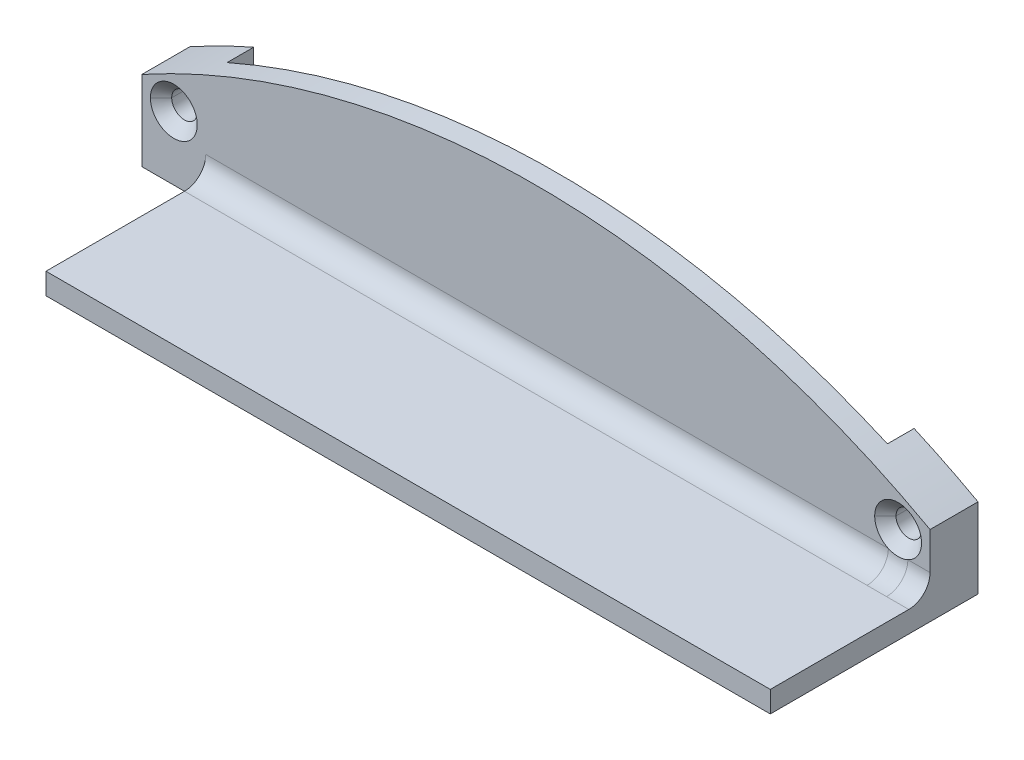
ISO-10303-21;
HEADER;
FILE_DESCRIPTION(('STEP AP214'),'2;1');
FILE_NAME('part.step','',(''),(''),'','','');
FILE_SCHEMA(('AUTOMOTIVE_DESIGN { 1 0 10303 214 1 1 1 1 }'));
ENDSEC;
DATA;
#1=APPLICATION_CONTEXT('core data for automotive mechanical design processes');
#2=APPLICATION_PROTOCOL_DEFINITION('international standard','automotive_design',2000,#1);
#3=PRODUCT_CONTEXT('',#1,'mechanical');
#4=PRODUCT('Part','Part','',(#3));
#5=PRODUCT_RELATED_PRODUCT_CATEGORY('part','',(#4));
#6=PRODUCT_DEFINITION_FORMATION('','',#4);
#7=PRODUCT_DEFINITION_CONTEXT('part definition',#1,'design');
#8=PRODUCT_DEFINITION('design','',#6,#7);
#9=PRODUCT_DEFINITION_SHAPE('','',#8);
#10=(LENGTH_UNIT() NAMED_UNIT(*) SI_UNIT(.MILLI.,.METRE.));
#11=(NAMED_UNIT(*) PLANE_ANGLE_UNIT() SI_UNIT($,.RADIAN.));
#12=(NAMED_UNIT(*) SI_UNIT($,.STERADIAN.) SOLID_ANGLE_UNIT());
#13=UNCERTAINTY_MEASURE_WITH_UNIT(LENGTH_MEASURE(1.E-05),#10,'distance_accuracy_value','');
#14=(GEOMETRIC_REPRESENTATION_CONTEXT(3) GLOBAL_UNCERTAINTY_ASSIGNED_CONTEXT((#13)) GLOBAL_UNIT_ASSIGNED_CONTEXT((#10,
#11,#12)) REPRESENTATION_CONTEXT('',''));
#15=CARTESIAN_POINT('',(0.,0.,0.));
#16=DIRECTION('',(0.,0.,1.));
#17=DIRECTION('',(1.,0.,0.));
#18=AXIS2_PLACEMENT_3D('',#15,#16,#17);
#19=CARTESIAN_POINT('',(3.,6.,2.));
#20=DIRECTION('',(0.,0.,1.));
#21=DIRECTION('',(1.,0.,0.));
#22=AXIS2_PLACEMENT_3D('',#19,#20,#21);
#23=CONICAL_SURFACE('',#22,2.2,0.785398163397448);
#24=CARTESIAN_POINT('',(3.,6.,1.));
#25=DIRECTION('',(0.,0.,1.));
#26=DIRECTION('',(1.,0.,0.));
#27=AXIS2_PLACEMENT_3D('',#24,#25,#26);
#28=CIRCLE('',#27,1.2);
#29=CARTESIAN_POINT('',(1.8,6.,1.));
#30=VERTEX_POINT('',#29);
#31=CARTESIAN_POINT('',(4.2,6.,1.));
#32=VERTEX_POINT('',#31);
#33=EDGE_CURVE('E41',#30,#32,#28,.T.);
#34=ORIENTED_EDGE('',*,*,#33,.F.);
#35=DIRECTION('',(-0.707106781186547,0.,0.707106781186548));
#36=VECTOR('',#35,1.);
#37=CARTESIAN_POINT('',(0.8,6.,2.));
#38=LINE('',#37,#36);
#39=CARTESIAN_POINT('',(0.8,6.,2.));
#40=VERTEX_POINT('',#39);
#41=EDGE_CURVE('E11',#30,#40,#38,.T.);
#42=ORIENTED_EDGE('',*,*,#41,.T.);
#43=CARTESIAN_POINT('',(3.,6.,2.));
#44=DIRECTION('',(0.,0.,1.));
#45=DIRECTION('',(1.,0.,0.));
#46=AXIS2_PLACEMENT_3D('',#43,#44,#45);
#47=CIRCLE('',#46,2.2);
#48=CARTESIAN_POINT('',(5.2,6.,2.));
#49=VERTEX_POINT('',#48);
#50=EDGE_CURVE('E27',#40,#49,#47,.T.);
#51=ORIENTED_EDGE('',*,*,#50,.T.);
#52=DIRECTION('',(0.707106781186547,0.,0.707106781186548));
#53=VECTOR('',#52,1.);
#54=CARTESIAN_POINT('',(5.2,6.,2.));
#55=LINE('',#54,#53);
#56=EDGE_CURVE('E255',#32,#49,#55,.T.);
#57=ORIENTED_EDGE('',*,*,#56,.F.);
#58=EDGE_LOOP('',(#34,#42,#51,#57));
#59=FACE_BOUND('',#58,.T.);
#60=ADVANCED_FACE('F16',(#59),#23,.F.);
#61=CARTESIAN_POINT('',(3.,6.,2.));
#62=DIRECTION('',(0.,0.,1.));
#63=DIRECTION('',(1.,0.,0.));
#64=AXIS2_PLACEMENT_3D('',#61,#62,#63);
#65=CYLINDRICAL_SURFACE('',#64,1.2);
#66=CARTESIAN_POINT('',(3.,6.,-2.5));
#67=DIRECTION('',(0.,0.,-1.));
#68=DIRECTION('',(-1.,0.,0.));
#69=AXIS2_PLACEMENT_3D('',#66,#67,#68);
#70=CIRCLE('',#69,1.2);
#71=CARTESIAN_POINT('',(4.2,6.,-2.5));
#72=VERTEX_POINT('',#71);
#73=CARTESIAN_POINT('',(1.8,6.,-2.5));
#74=VERTEX_POINT('',#73);
#75=EDGE_CURVE('E294',#72,#74,#70,.T.);
#76=ORIENTED_EDGE('',*,*,#75,.T.);
#77=DIRECTION('',(0.,0.,1.));
#78=VECTOR('',#77,1.);
#79=CARTESIAN_POINT('',(1.8,6.,2.));
#80=LINE('',#79,#78);
#81=EDGE_CURVE('E298',#74,#30,#80,.T.);
#82=ORIENTED_EDGE('',*,*,#81,.T.);
#83=ORIENTED_EDGE('',*,*,#33,.T.);
#84=DIRECTION('',(0.,0.,1.));
#85=VECTOR('',#84,1.);
#86=CARTESIAN_POINT('',(4.2,6.,2.));
#87=LINE('',#86,#85);
#88=EDGE_CURVE('E254',#72,#32,#87,.T.);
#89=ORIENTED_EDGE('',*,*,#88,.F.);
#90=EDGE_LOOP('',(#76,#82,#83,#89));
#91=FACE_BOUND('',#90,.T.);
#92=ADVANCED_FACE('F387',(#91),#65,.F.);
#93=CARTESIAN_POINT('',(71.,6.,2.));
#94=DIRECTION('',(0.,0.,1.));
#95=DIRECTION('',(1.,0.,0.));
#96=AXIS2_PLACEMENT_3D('',#93,#94,#95);
#97=CONICAL_SURFACE('',#96,2.2,0.785398163397455);
#98=CARTESIAN_POINT('',(71.,6.,1.));
#99=DIRECTION('',(0.,0.,1.));
#100=DIRECTION('',(1.,0.,0.));
#101=AXIS2_PLACEMENT_3D('',#98,#99,#100);
#102=CIRCLE('',#101,1.2);
#103=CARTESIAN_POINT('',(69.8,6.,1.));
#104=VERTEX_POINT('',#103);
#105=CARTESIAN_POINT('',(72.2,6.,1.));
#106=VERTEX_POINT('',#105);
#107=EDGE_CURVE('E318',#104,#106,#102,.T.);
#108=ORIENTED_EDGE('',*,*,#107,.F.);
#109=DIRECTION('',(-0.707106781186552,0.,0.707106781186543));
#110=VECTOR('',#109,1.);
#111=CARTESIAN_POINT('',(68.8,6.,2.));
#112=LINE('',#111,#110);
#113=CARTESIAN_POINT('',(68.8,6.,2.));
#114=VERTEX_POINT('',#113);
#115=EDGE_CURVE('E333',#104,#114,#112,.T.);
#116=ORIENTED_EDGE('',*,*,#115,.T.);
#117=CARTESIAN_POINT('',(71.,6.,2.));
#118=DIRECTION('',(0.,0.,1.));
#119=DIRECTION('',(1.,0.,0.));
#120=AXIS2_PLACEMENT_3D('',#117,#118,#119);
#121=CIRCLE('',#120,2.2);
#122=CARTESIAN_POINT('',(70.0834848610088,4.,2.));
#123=VERTEX_POINT('',#122);
#124=EDGE_CURVE('E469',#114,#123,#121,.T.);
#125=ORIENTED_EDGE('',*,*,#124,.T.);
#126=CARTESIAN_POINT('',(71.9165151389912,4.,2.));
#127=CARTESIAN_POINT('',(71.7904590776195,3.94223383184173,2.));
#128=CARTESIAN_POINT('',(71.6469467377403,3.89122086907555,2.00000000060984));
#129=CARTESIAN_POINT('',(71.3357030742167,3.81990989217853,1.99999999939016));
#130=CARTESIAN_POINT('',(71.1679841261311,3.79999561501596,2.00000000000037));
#131=CARTESIAN_POINT('',(70.8319010379191,3.80000438648259,1.99999999999963));
#132=CARTESIAN_POINT('',(70.6641748830029,3.81992811652026,1.99999999939023));
#133=CARTESIAN_POINT('',(70.3529202344418,3.89126109354636,2.00000000060977));
#134=CARTESIAN_POINT('',(70.2093938289862,3.94230123813048,2.));
#135=CARTESIAN_POINT('',(70.0834848610088,4.,2.));
#136=(BOUNDED_CURVE() B_SPLINE_CURVE(3,(#126,#127,#128,#129,#130,#131,#132,#133,#134,#135),
.UNSPECIFIED.,.F.,.F.) B_SPLINE_CURVE_WITH_KNOTS((4,2,2,2,4),(0.00382882052453302,
0.00428506631490956,0.0047413121052861,0.00519755789566263,0.00565380368603917),
.UNSPECIFIED.) CURVE() GEOMETRIC_REPRESENTATION_ITEM() RATIONAL_B_SPLINE_CURVE((1.,1.,1.,1.,1.,
1.,1.,1.,1.,1.)) REPRESENTATION_ITEM(''));
#137=CARTESIAN_POINT('',(71.9165151389912,4.,2.));
#138=VERTEX_POINT('',#137);
#139=EDGE_CURVE('E369',#123,#138,#136,.F.);
#140=ORIENTED_EDGE('',*,*,#139,.T.);
#141=CARTESIAN_POINT('',(71.,6.,2.));
#142=DIRECTION('',(0.,0.,1.));
#143=DIRECTION('',(1.,0.,0.));
#144=AXIS2_PLACEMENT_3D('',#141,#142,#143);
#145=CIRCLE('',#144,2.2);
#146=CARTESIAN_POINT('',(73.2,6.,2.));
#147=VERTEX_POINT('',#146);
#148=EDGE_CURVE('E263',#138,#147,#145,.T.);
#149=ORIENTED_EDGE('',*,*,#148,.T.);
#150=DIRECTION('',(0.707106781186552,0.,0.707106781186543));
#151=VECTOR('',#150,1.);
#152=CARTESIAN_POINT('',(73.2,6.,2.));
#153=LINE('',#152,#151);
#154=EDGE_CURVE('E241',#106,#147,#153,.T.);
#155=ORIENTED_EDGE('',*,*,#154,.F.);
#156=EDGE_LOOP('',(#108,#116,#125,#140,#149,#155));
#157=FACE_BOUND('',#156,.T.);
#158=ADVANCED_FACE('F376',(#157),#97,.F.);
#159=CARTESIAN_POINT('',(71.,6.,2.));
#160=DIRECTION('',(0.,0.,1.));
#161=DIRECTION('',(1.,0.,0.));
#162=AXIS2_PLACEMENT_3D('',#159,#160,#161);
#163=CYLINDRICAL_SURFACE('',#162,1.2);
#164=CARTESIAN_POINT('',(71.,6.,-2.5));
#165=DIRECTION('',(0.,0.,-1.));
#166=DIRECTION('',(-1.,0.,0.));
#167=AXIS2_PLACEMENT_3D('',#164,#165,#166);
#168=CIRCLE('',#167,1.2);
#169=CARTESIAN_POINT('',(72.2,6.,-2.5));
#170=VERTEX_POINT('',#169);
#171=CARTESIAN_POINT('',(69.8,6.,-2.5));
#172=VERTEX_POINT('',#171);
#173=EDGE_CURVE('E259',#170,#172,#168,.T.);
#174=ORIENTED_EDGE('',*,*,#173,.T.);
#175=DIRECTION('',(0.,0.,1.));
#176=VECTOR('',#175,1.);
#177=CARTESIAN_POINT('',(69.8,6.,2.));
#178=LINE('',#177,#176);
#179=EDGE_CURVE('E264',#172,#104,#178,.T.);
#180=ORIENTED_EDGE('',*,*,#179,.T.);
#181=ORIENTED_EDGE('',*,*,#107,.T.);
#182=DIRECTION('',(0.,0.,1.));
#183=VECTOR('',#182,1.);
#184=CARTESIAN_POINT('',(72.2,6.,2.));
#185=LINE('',#184,#183);
#186=EDGE_CURVE('E287',#170,#106,#185,.T.);
#187=ORIENTED_EDGE('',*,*,#186,.F.);
#188=EDGE_LOOP('',(#174,#180,#181,#187));
#189=FACE_BOUND('',#188,.T.);
#190=ADVANCED_FACE('F386',(#189),#163,.F.);
#191=CARTESIAN_POINT('',(37.,-59.8026315789474,2.));
#192=DIRECTION('',(0.,0.,-1.));
#193=DIRECTION('',(0.,-1.,0.));
#194=AXIS2_PLACEMENT_3D('',#191,#192,#193);
#195=PLANE('',#194);
#196=DIRECTION('',(0.,-1.,0.));
#197=VECTOR('',#196,1.);
#198=CARTESIAN_POINT('',(6.,0.,2.));
#199=LINE('',#198,#197);
#200=CARTESIAN_POINT('',(6.,4.,2.));
#201=VERTEX_POINT('',#200);
#202=CARTESIAN_POINT('',(6.,0.,2.));
#203=VERTEX_POINT('',#202);
#204=EDGE_CURVE('E340',#201,#203,#199,.T.);
#205=ORIENTED_EDGE('',*,*,#204,.F.);
#206=DIRECTION('',(1.,0.,0.));
#207=VECTOR('',#206,1.);
#208=CARTESIAN_POINT('',(74.,4.,2.));
#209=LINE('',#208,#207);
#210=EDGE_CURVE('E321',#201,#123,#209,.T.);
#211=ORIENTED_EDGE('',*,*,#210,.T.);
#212=ORIENTED_EDGE('',*,*,#124,.F.);
#213=CARTESIAN_POINT('',(71.,6.,2.));
#214=DIRECTION('',(0.,0.,1.));
#215=DIRECTION('',(1.,0.,0.));
#216=AXIS2_PLACEMENT_3D('',#213,#214,#215);
#217=CIRCLE('',#216,2.2);
#218=EDGE_CURVE('E245',#147,#114,#217,.T.);
#219=ORIENTED_EDGE('',*,*,#218,.F.);
#220=ORIENTED_EDGE('',*,*,#148,.F.);
#221=DIRECTION('',(1.,0.,0.));
#222=VECTOR('',#221,1.);
#223=CARTESIAN_POINT('',(74.,4.,2.));
#224=LINE('',#223,#222);
#225=CARTESIAN_POINT('',(74.,4.,2.));
#226=VERTEX_POINT('',#225);
#227=EDGE_CURVE('E279',#138,#226,#224,.T.);
#228=ORIENTED_EDGE('',*,*,#227,.T.);
#229=DIRECTION('',(0.,1.,0.));
#230=VECTOR('',#229,1.);
#231=CARTESIAN_POINT('',(74.,0.,2.));
#232=LINE('',#231,#230);
#233=CARTESIAN_POINT('',(74.,7.5,2.));
#234=VERTEX_POINT('',#233);
#235=EDGE_CURVE('E275',#226,#234,#232,.T.);
#236=ORIENTED_EDGE('',*,*,#235,.T.);
#237=CARTESIAN_POINT('',(37.,-59.8026315789474,2.));
#238=DIRECTION('',(0.,0.,1.));
#239=DIRECTION('',(-1.,0.,0.));
#240=AXIS2_PLACEMENT_3D('',#237,#238,#239);
#241=CIRCLE('',#240,76.8026315789473);
#242=CARTESIAN_POINT('',(0.,7.5,2.));
#243=VERTEX_POINT('',#242);
#244=EDGE_CURVE('E239',#234,#243,#241,.T.);
#245=ORIENTED_EDGE('',*,*,#244,.T.);
#246=DIRECTION('',(0.,-1.,0.));
#247=VECTOR('',#246,1.);
#248=CARTESIAN_POINT('',(0.,0.,2.));
#249=LINE('',#248,#247);
#250=CARTESIAN_POINT('',(0.,0.,2.));
#251=VERTEX_POINT('',#250);
#252=EDGE_CURVE('E235',#243,#251,#249,.T.);
#253=ORIENTED_EDGE('',*,*,#252,.T.);
#254=DIRECTION('',(1.,0.,0.));
#255=VECTOR('',#254,1.);
#256=CARTESIAN_POINT('',(0.,0.,2.));
#257=LINE('',#256,#255);
#258=EDGE_CURVE('E240',#251,#203,#257,.T.);
#259=ORIENTED_EDGE('',*,*,#258,.T.);
#260=EDGE_LOOP('',(#205,#211,#212,#219,#220,#228,#236,#245,#253,#259));
#261=FACE_BOUND('',#260,.T.);
#262=CARTESIAN_POINT('',(3.,6.,2.));
#263=DIRECTION('',(0.,0.,1.));
#264=DIRECTION('',(1.,0.,0.));
#265=AXIS2_PLACEMENT_3D('',#262,#263,#264);
#266=CIRCLE('',#265,2.2);
#267=EDGE_CURVE('E548',#49,#40,#266,.T.);
#268=ORIENTED_EDGE('',*,*,#267,.F.);
#269=ORIENTED_EDGE('',*,*,#50,.F.);
#270=EDGE_LOOP('',(#268,#269));
#271=FACE_BOUND('',#270,.T.);
#272=ADVANCED_FACE('F397',(#261,#271),#195,.F.);
#273=CARTESIAN_POINT('',(37.,-59.8026315789474,0.));
#274=DIRECTION('',(0.,0.,-1.));
#275=DIRECTION('',(0.,-1.,0.));
#276=AXIS2_PLACEMENT_3D('',#273,#274,#275);
#277=PLANE('',#276);
#278=CARTESIAN_POINT('',(37.,-59.8026315789474,0.));
#279=DIRECTION('',(0.,0.,1.));
#280=DIRECTION('',(-1.,0.,0.));
#281=AXIS2_PLACEMENT_3D('',#278,#279,#280);
#282=CIRCLE('',#281,76.8026315789473);
#283=CARTESIAN_POINT('',(68.,10.4657412316673,0.));
#284=VERTEX_POINT('',#283);
#285=CARTESIAN_POINT('',(6.,10.4657412316673,0.));
#286=VERTEX_POINT('',#285);
#287=EDGE_CURVE('E202',#284,#286,#282,.T.);
#288=ORIENTED_EDGE('',*,*,#287,.F.);
#289=DIRECTION('',(0.,1.,0.));
#290=VECTOR('',#289,1.);
#291=CARTESIAN_POINT('',(68.,0.,0.));
#292=LINE('',#291,#290);
#293=CARTESIAN_POINT('',(68.,0.,0.));
#294=VERTEX_POINT('',#293);
#295=EDGE_CURVE('E347',#294,#284,#292,.T.);
#296=ORIENTED_EDGE('',*,*,#295,.F.);
#297=DIRECTION('',(1.,0.,0.));
#298=VECTOR('',#297,1.);
#299=CARTESIAN_POINT('',(0.,0.,0.));
#300=LINE('',#299,#298);
#301=CARTESIAN_POINT('',(6.,0.,0.));
#302=VERTEX_POINT('',#301);
#303=EDGE_CURVE('E359',#302,#294,#300,.T.);
#304=ORIENTED_EDGE('',*,*,#303,.F.);
#305=DIRECTION('',(0.,-1.,0.));
#306=VECTOR('',#305,1.);
#307=CARTESIAN_POINT('',(6.,0.,0.));
#308=LINE('',#307,#306);
#309=EDGE_CURVE('E206',#286,#302,#308,.T.);
#310=ORIENTED_EDGE('',*,*,#309,.F.);
#311=EDGE_LOOP('',(#288,#296,#304,#310));
#312=FACE_BOUND('',#311,.T.);
#313=ADVANCED_FACE('F400',(#312),#277,.T.);
#314=CARTESIAN_POINT('',(0.,0.,2.));
#315=DIRECTION('',(1.,0.,0.));
#316=DIRECTION('',(0.,1.,0.));
#317=AXIS2_PLACEMENT_3D('',#314,#315,#316);
#318=PLANE('',#317);
#319=DIRECTION('',(0.,0.,-1.));
#320=VECTOR('',#319,1.);
#321=CARTESIAN_POINT('',(0.,7.5,2.));
#322=LINE('',#321,#320);
#323=CARTESIAN_POINT('',(0.,7.5,-2.5));
#324=VERTEX_POINT('',#323);
#325=EDGE_CURVE('E268',#243,#324,#322,.T.);
#326=ORIENTED_EDGE('',*,*,#325,.T.);
#327=DIRECTION('',(0.,1.,0.));
#328=VECTOR('',#327,1.);
#329=CARTESIAN_POINT('',(0.,0.,-2.5));
#330=LINE('',#329,#328);
#331=CARTESIAN_POINT('',(0.,0.,-2.5));
#332=VERTEX_POINT('',#331);
#333=EDGE_CURVE('E216',#332,#324,#330,.T.);
#334=ORIENTED_EDGE('',*,*,#333,.F.);
#335=DIRECTION('',(0.,0.,-1.));
#336=VECTOR('',#335,1.);
#337=CARTESIAN_POINT('',(0.,0.,2.));
#338=LINE('',#337,#336);
#339=EDGE_CURVE('E280',#251,#332,#338,.T.);
#340=ORIENTED_EDGE('',*,*,#339,.F.);
#341=ORIENTED_EDGE('',*,*,#252,.F.);
#342=EDGE_LOOP('',(#326,#334,#340,#341));
#343=FACE_BOUND('',#342,.T.);
#344=ADVANCED_FACE('F420',(#343),#318,.F.);
#345=CARTESIAN_POINT('',(0.,0.,2.));
#346=DIRECTION('',(0.,1.,0.));
#347=DIRECTION('',(1.,0.,0.));
#348=AXIS2_PLACEMENT_3D('',#345,#346,#347);
#349=PLANE('',#348);
#350=ORIENTED_EDGE('',*,*,#339,.T.);
#351=DIRECTION('',(-1.,0.,0.));
#352=VECTOR('',#351,1.);
#353=CARTESIAN_POINT('',(6.,0.,-2.5));
#354=LINE('',#353,#352);
#355=CARTESIAN_POINT('',(6.,0.,-2.5));
#356=VERTEX_POINT('',#355);
#357=EDGE_CURVE('E225',#356,#332,#354,.T.);
#358=ORIENTED_EDGE('',*,*,#357,.F.);
#359=DIRECTION('',(0.,0.,1.));
#360=VECTOR('',#359,1.);
#361=CARTESIAN_POINT('',(6.,0.,-2.5));
#362=LINE('',#361,#360);
#363=EDGE_CURVE('E223',#356,#302,#362,.T.);
#364=ORIENTED_EDGE('',*,*,#363,.T.);
#365=ORIENTED_EDGE('',*,*,#303,.T.);
#366=DIRECTION('',(0.,0.,1.));
#367=VECTOR('',#366,1.);
#368=CARTESIAN_POINT('',(68.,0.,-2.5));
#369=LINE('',#368,#367);
#370=CARTESIAN_POINT('',(68.,0.,-2.5));
#371=VERTEX_POINT('',#370);
#372=EDGE_CURVE('E351',#371,#294,#369,.T.);
#373=ORIENTED_EDGE('',*,*,#372,.F.);
#374=DIRECTION('',(-1.,0.,0.));
#375=VECTOR('',#374,1.);
#376=CARTESIAN_POINT('',(74.,0.,-2.5));
#377=LINE('',#376,#375);
#378=CARTESIAN_POINT('',(74.,0.,-2.5));
#379=VERTEX_POINT('',#378);
#380=EDGE_CURVE('E288',#379,#371,#377,.T.);
#381=ORIENTED_EDGE('',*,*,#380,.F.);
#382=DIRECTION('',(0.,0.,-1.));
#383=VECTOR('',#382,1.);
#384=CARTESIAN_POINT('',(74.,0.,2.));
#385=LINE('',#384,#383);
#386=CARTESIAN_POINT('',(74.,0.,17.));
#387=VERTEX_POINT('',#386);
#388=EDGE_CURVE('E311',#387,#379,#385,.T.);
#389=ORIENTED_EDGE('',*,*,#388,.F.);
#390=DIRECTION('',(1.,0.,0.));
#391=VECTOR('',#390,1.);
#392=CARTESIAN_POINT('',(74.,0.,17.));
#393=LINE('',#392,#391);
#394=CARTESIAN_POINT('',(6.,0.,17.));
#395=VERTEX_POINT('',#394);
#396=EDGE_CURVE('E326',#395,#387,#393,.T.);
#397=ORIENTED_EDGE('',*,*,#396,.F.);
#398=DIRECTION('',(0.,0.,-1.));
#399=VECTOR('',#398,1.);
#400=CARTESIAN_POINT('',(6.,0.,17.));
#401=LINE('',#400,#399);
#402=EDGE_CURVE('E355',#395,#203,#401,.T.);
#403=ORIENTED_EDGE('',*,*,#402,.T.);
#404=ORIENTED_EDGE('',*,*,#258,.F.);
#405=EDGE_LOOP('',(#350,#358,#364,#365,#373,#381,#389,#397,#403,#404));
#406=FACE_BOUND('',#405,.T.);
#407=ADVANCED_FACE('F435',(#406),#349,.F.);
#408=CARTESIAN_POINT('',(74.,0.,2.));
#409=DIRECTION('',(-1.,0.,0.));
#410=DIRECTION('',(0.,0.,1.));
#411=AXIS2_PLACEMENT_3D('',#408,#409,#410);
#412=PLANE('',#411);
#413=ORIENTED_EDGE('',*,*,#388,.T.);
#414=DIRECTION('',(0.,-1.,0.));
#415=VECTOR('',#414,1.);
#416=CARTESIAN_POINT('',(74.,7.5,-2.5));
#417=LINE('',#416,#415);
#418=CARTESIAN_POINT('',(74.,7.5,-2.5));
#419=VERTEX_POINT('',#418);
#420=EDGE_CURVE('E292',#419,#379,#417,.T.);
#421=ORIENTED_EDGE('',*,*,#420,.F.);
#422=DIRECTION('',(0.,0.,-1.));
#423=VECTOR('',#422,1.);
#424=CARTESIAN_POINT('',(74.,7.5,2.));
#425=LINE('',#424,#423);
#426=EDGE_CURVE('E249',#234,#419,#425,.T.);
#427=ORIENTED_EDGE('',*,*,#426,.F.);
#428=ORIENTED_EDGE('',*,*,#235,.F.);
#429=CARTESIAN_POINT('',(74.,4.,4.));
#430=DIRECTION('',(-1.,0.,0.));
#431=DIRECTION('',(0.,0.,1.));
#432=AXIS2_PLACEMENT_3D('',#429,#430,#431);
#433=CIRCLE('',#432,2.);
#434=CARTESIAN_POINT('',(74.,2.,4.));
#435=VERTEX_POINT('',#434);
#436=EDGE_CURVE('E307',#226,#435,#433,.T.);
#437=ORIENTED_EDGE('',*,*,#436,.T.);
#438=DIRECTION('',(0.,0.,-1.));
#439=VECTOR('',#438,1.);
#440=CARTESIAN_POINT('',(74.,2.,17.));
#441=LINE('',#440,#439);
#442=CARTESIAN_POINT('',(74.,2.,17.));
#443=VERTEX_POINT('',#442);
#444=EDGE_CURVE('E273',#443,#435,#441,.T.);
#445=ORIENTED_EDGE('',*,*,#444,.F.);
#446=DIRECTION('',(0.,1.,0.));
#447=VECTOR('',#446,1.);
#448=CARTESIAN_POINT('',(74.,0.,17.));
#449=LINE('',#448,#447);
#450=EDGE_CURVE('E317',#387,#443,#449,.T.);
#451=ORIENTED_EDGE('',*,*,#450,.F.);
#452=EDGE_LOOP('',(#413,#421,#427,#428,#437,#445,#451));
#453=FACE_BOUND('',#452,.T.);
#454=ADVANCED_FACE('F18',(#453),#412,.F.);
#455=CARTESIAN_POINT('',(37.,-59.8026315789474,2.));
#456=DIRECTION('',(0.,0.,-1.));
#457=DIRECTION('',(-1.,0.,0.));
#458=AXIS2_PLACEMENT_3D('',#455,#456,#457);
#459=CYLINDRICAL_SURFACE('',#458,76.8026315789473);
#460=ORIENTED_EDGE('',*,*,#426,.T.);
#461=CARTESIAN_POINT('',(37.,-59.8026315789474,-2.5));
#462=DIRECTION('',(0.,0.,-1.));
#463=DIRECTION('',(-1.,0.,0.));
#464=AXIS2_PLACEMENT_3D('',#461,#462,#463);
#465=CIRCLE('',#464,76.8026315789473);
#466=CARTESIAN_POINT('',(68.,10.4657412316673,-2.5));
#467=VERTEX_POINT('',#466);
#468=EDGE_CURVE('E207',#467,#419,#465,.T.);
#469=ORIENTED_EDGE('',*,*,#468,.F.);
#470=DIRECTION('',(0.,0.,1.));
#471=VECTOR('',#470,1.);
#472=CARTESIAN_POINT('',(68.,10.4657412316673,-2.5));
#473=LINE('',#472,#471);
#474=EDGE_CURVE('E246',#467,#284,#473,.T.);
#475=ORIENTED_EDGE('',*,*,#474,.T.);
#476=ORIENTED_EDGE('',*,*,#287,.T.);
#477=DIRECTION('',(0.,0.,1.));
#478=VECTOR('',#477,1.);
#479=CARTESIAN_POINT('',(6.,10.4657412316672,-2.5));
#480=LINE('',#479,#478);
#481=CARTESIAN_POINT('',(6.,10.4657412316672,-2.5));
#482=VERTEX_POINT('',#481);
#483=EDGE_CURVE('E194',#482,#286,#480,.T.);
#484=ORIENTED_EDGE('',*,*,#483,.F.);
#485=CARTESIAN_POINT('',(37.,-59.8026315789474,-2.5));
#486=DIRECTION('',(0.,0.,-1.));
#487=DIRECTION('',(-1.,0.,0.));
#488=AXIS2_PLACEMENT_3D('',#485,#486,#487);
#489=CIRCLE('',#488,76.8026315789473);
#490=EDGE_CURVE('E199',#324,#482,#489,.T.);
#491=ORIENTED_EDGE('',*,*,#490,.F.);
#492=ORIENTED_EDGE('',*,*,#325,.F.);
#493=ORIENTED_EDGE('',*,*,#244,.F.);
#494=EDGE_LOOP('',(#460,#469,#475,#476,#484,#491,#492,#493));
#495=FACE_BOUND('',#494,.T.);
#496=ADVANCED_FACE('F197',(#495),#459,.T.);
#497=CARTESIAN_POINT('',(71.,6.,2.));
#498=DIRECTION('',(0.,0.,1.));
#499=DIRECTION('',(1.,0.,0.));
#500=AXIS2_PLACEMENT_3D('',#497,#498,#499);
#501=CYLINDRICAL_SURFACE('',#500,1.2);
#502=ORIENTED_EDGE('',*,*,#179,.F.);
#503=CARTESIAN_POINT('',(71.,6.,-2.5));
#504=DIRECTION('',(0.,0.,-1.));
#505=DIRECTION('',(-1.,0.,0.));
#506=AXIS2_PLACEMENT_3D('',#503,#504,#505);
#507=CIRCLE('',#506,1.2);
#508=EDGE_CURVE('E258',#172,#170,#507,.T.);
#509=ORIENTED_EDGE('',*,*,#508,.T.);
#510=ORIENTED_EDGE('',*,*,#186,.T.);
#511=CARTESIAN_POINT('',(71.,6.,1.));
#512=DIRECTION('',(0.,0.,1.));
#513=DIRECTION('',(1.,0.,0.));
#514=AXIS2_PLACEMENT_3D('',#511,#512,#513);
#515=CIRCLE('',#514,1.2);
#516=EDGE_CURVE('E244',#106,#104,#515,.T.);
#517=ORIENTED_EDGE('',*,*,#516,.T.);
#518=EDGE_LOOP('',(#502,#509,#510,#517));
#519=FACE_BOUND('',#518,.T.);
#520=ADVANCED_FACE('F390',(#519),#501,.F.);
#521=CARTESIAN_POINT('',(71.,6.,2.));
#522=DIRECTION('',(0.,0.,1.));
#523=DIRECTION('',(1.,0.,0.));
#524=AXIS2_PLACEMENT_3D('',#521,#522,#523);
#525=CONICAL_SURFACE('',#524,2.2,0.785398163397455);
#526=ORIENTED_EDGE('',*,*,#115,.F.);
#527=ORIENTED_EDGE('',*,*,#516,.F.);
#528=ORIENTED_EDGE('',*,*,#154,.T.);
#529=ORIENTED_EDGE('',*,*,#218,.T.);
#530=EDGE_LOOP('',(#526,#527,#528,#529));
#531=FACE_BOUND('',#530,.T.);
#532=ADVANCED_FACE('F393',(#531),#525,.F.);
#533=CARTESIAN_POINT('',(3.,6.,2.));
#534=DIRECTION('',(0.,0.,1.));
#535=DIRECTION('',(1.,0.,0.));
#536=AXIS2_PLACEMENT_3D('',#533,#534,#535);
#537=CYLINDRICAL_SURFACE('',#536,1.2);
#538=ORIENTED_EDGE('',*,*,#81,.F.);
#539=CARTESIAN_POINT('',(3.,6.,-2.5));
#540=DIRECTION('',(0.,0.,-1.));
#541=DIRECTION('',(-1.,0.,0.));
#542=AXIS2_PLACEMENT_3D('',#539,#540,#541);
#543=CIRCLE('',#542,1.2);
#544=EDGE_CURVE('E543',#74,#72,#543,.T.);
#545=ORIENTED_EDGE('',*,*,#544,.T.);
#546=ORIENTED_EDGE('',*,*,#88,.T.);
#547=CARTESIAN_POINT('',(3.,6.,1.));
#548=DIRECTION('',(0.,0.,1.));
#549=DIRECTION('',(1.,0.,0.));
#550=AXIS2_PLACEMENT_3D('',#547,#548,#549);
#551=CIRCLE('',#550,1.2);
#552=EDGE_CURVE('E250',#32,#30,#551,.T.);
#553=ORIENTED_EDGE('',*,*,#552,.T.);
#554=EDGE_LOOP('',(#538,#545,#546,#553));
#555=FACE_BOUND('',#554,.T.);
#556=ADVANCED_FACE('F442',(#555),#537,.F.);
#557=CARTESIAN_POINT('',(3.,6.,2.));
#558=DIRECTION('',(0.,0.,1.));
#559=DIRECTION('',(1.,0.,0.));
#560=AXIS2_PLACEMENT_3D('',#557,#558,#559);
#561=CONICAL_SURFACE('',#560,2.2,0.785398163397448);
#562=ORIENTED_EDGE('',*,*,#41,.F.);
#563=ORIENTED_EDGE('',*,*,#552,.F.);
#564=ORIENTED_EDGE('',*,*,#56,.T.);
#565=ORIENTED_EDGE('',*,*,#267,.T.);
#566=EDGE_LOOP('',(#562,#563,#564,#565));
#567=FACE_BOUND('',#566,.T.);
#568=ADVANCED_FACE('F432',(#567),#561,.F.);
#569=CARTESIAN_POINT('',(37.,-59.8026315789474,-2.5));
#570=DIRECTION('',(0.,0.,-1.));
#571=DIRECTION('',(0.,-1.,0.));
#572=AXIS2_PLACEMENT_3D('',#569,#570,#571);
#573=PLANE('',#572);
#574=ORIENTED_EDGE('',*,*,#333,.T.);
#575=ORIENTED_EDGE('',*,*,#490,.T.);
#576=DIRECTION('',(0.,-1.,0.));
#577=VECTOR('',#576,1.);
#578=CARTESIAN_POINT('',(6.,0.,-2.5));
#579=LINE('',#578,#577);
#580=EDGE_CURVE('E214',#482,#356,#579,.T.);
#581=ORIENTED_EDGE('',*,*,#580,.T.);
#582=ORIENTED_EDGE('',*,*,#357,.T.);
#583=EDGE_LOOP('',(#574,#575,#581,#582));
#584=FACE_BOUND('',#583,.T.);
#585=ORIENTED_EDGE('',*,*,#75,.F.);
#586=ORIENTED_EDGE('',*,*,#544,.F.);
#587=EDGE_LOOP('',(#585,#586));
#588=FACE_BOUND('',#587,.T.);
#589=ADVANCED_FACE('F211',(#584,#588),#573,.T.);
#590=CARTESIAN_POINT('',(6.,0.,-2.5));
#591=DIRECTION('',(-1.,0.,0.));
#592=DIRECTION('',(0.,1.,0.));
#593=AXIS2_PLACEMENT_3D('',#590,#591,#592);
#594=PLANE('',#593);
#595=ORIENTED_EDGE('',*,*,#309,.T.);
#596=ORIENTED_EDGE('',*,*,#363,.F.);
#597=ORIENTED_EDGE('',*,*,#580,.F.);
#598=ORIENTED_EDGE('',*,*,#483,.T.);
#599=EDGE_LOOP('',(#595,#596,#597,#598));
#600=FACE_BOUND('',#599,.T.);
#601=ADVANCED_FACE('F221',(#600),#594,.F.);
#602=CARTESIAN_POINT('',(37.,-59.8026315789474,-2.5));
#603=DIRECTION('',(0.,0.,-1.));
#604=DIRECTION('',(0.,-1.,0.));
#605=AXIS2_PLACEMENT_3D('',#602,#603,#604);
#606=PLANE('',#605);
#607=ORIENTED_EDGE('',*,*,#468,.T.);
#608=ORIENTED_EDGE('',*,*,#420,.T.);
#609=ORIENTED_EDGE('',*,*,#380,.T.);
#610=DIRECTION('',(0.,1.,0.));
#611=VECTOR('',#610,1.);
#612=CARTESIAN_POINT('',(68.,0.,-2.5));
#613=LINE('',#612,#611);
#614=EDGE_CURVE('E293',#371,#467,#613,.T.);
#615=ORIENTED_EDGE('',*,*,#614,.T.);
#616=EDGE_LOOP('',(#607,#608,#609,#615));
#617=FACE_BOUND('',#616,.T.);
#618=ORIENTED_EDGE('',*,*,#173,.F.);
#619=ORIENTED_EDGE('',*,*,#508,.F.);
#620=EDGE_LOOP('',(#618,#619));
#621=FACE_BOUND('',#620,.T.);
#622=ADVANCED_FACE('F388',(#617,#621),#606,.T.);
#623=CARTESIAN_POINT('',(68.,0.,-2.5));
#624=DIRECTION('',(1.,0.,0.));
#625=DIRECTION('',(0.,1.,0.));
#626=AXIS2_PLACEMENT_3D('',#623,#624,#625);
#627=PLANE('',#626);
#628=ORIENTED_EDGE('',*,*,#295,.T.);
#629=ORIENTED_EDGE('',*,*,#474,.F.);
#630=ORIENTED_EDGE('',*,*,#614,.F.);
#631=ORIENTED_EDGE('',*,*,#372,.T.);
#632=EDGE_LOOP('',(#628,#629,#630,#631));
#633=FACE_BOUND('',#632,.T.);
#634=ADVANCED_FACE('F407',(#633),#627,.F.);
#635=CARTESIAN_POINT('',(74.,2.,17.));
#636=DIRECTION('',(0.,-1.,0.));
#637=DIRECTION('',(0.,0.,-1.));
#638=AXIS2_PLACEMENT_3D('',#635,#636,#637);
#639=PLANE('',#638);
#640=ORIENTED_EDGE('',*,*,#444,.T.);
#641=DIRECTION('',(-1.,0.,0.));
#642=VECTOR('',#641,1.);
#643=CARTESIAN_POINT('',(6.,2.,4.));
#644=LINE('',#643,#642);
#645=CARTESIAN_POINT('',(71.9165151389912,2.,4.));
#646=VERTEX_POINT('',#645);
#647=EDGE_CURVE('E269',#435,#646,#644,.T.);
#648=ORIENTED_EDGE('',*,*,#647,.T.);
#649=CARTESIAN_POINT('',(71.9165151389912,2.,4.));
#650=CARTESIAN_POINT('',(71.6110156914909,2.,4.));
#651=CARTESIAN_POINT('',(71.3055527901186,2.,3.98997569324243));
#652=CARTESIAN_POINT('',(70.6945539010894,2.,3.98997405532705));
#653=CARTESIAN_POINT('',(70.389063094237,2.,4.));
#654=CARTESIAN_POINT('',(70.0834848610088,2.,4.));
#655=(BOUNDED_CURVE() B_SPLINE_CURVE(3,(#649,#650,#651,#652,#653,#654),.UNSPECIFIED.,.F.,
.F.) B_SPLINE_CURVE_WITH_KNOTS((4,2,4),(0.,0.00091649225174204,0.00183298450348408),
.UNSPECIFIED.) CURVE() GEOMETRIC_REPRESENTATION_ITEM() RATIONAL_B_SPLINE_CURVE((1.,1.,1.,1.,1.,1.)) REPRESENTATION_ITEM(''));
#656=CARTESIAN_POINT('',(70.0834848610088,2.,4.));
#657=VERTEX_POINT('',#656);
#658=EDGE_CURVE('E274',#646,#657,#655,.T.);
#659=ORIENTED_EDGE('',*,*,#658,.T.);
#660=DIRECTION('',(-1.,0.,0.));
#661=VECTOR('',#660,1.);
#662=CARTESIAN_POINT('',(6.,2.,4.));
#663=LINE('',#662,#661);
#664=CARTESIAN_POINT('',(6.,2.,4.));
#665=VERTEX_POINT('',#664);
#666=EDGE_CURVE('E343',#657,#665,#663,.T.);
#667=ORIENTED_EDGE('',*,*,#666,.T.);
#668=DIRECTION('',(0.,0.,-1.));
#669=VECTOR('',#668,1.);
#670=CARTESIAN_POINT('',(6.,2.,17.));
#671=LINE('',#670,#669);
#672=CARTESIAN_POINT('',(6.,2.,17.));
#673=VERTEX_POINT('',#672);
#674=EDGE_CURVE('E316',#673,#665,#671,.T.);
#675=ORIENTED_EDGE('',*,*,#674,.F.);
#676=DIRECTION('',(-1.,0.,0.));
#677=VECTOR('',#676,1.);
#678=CARTESIAN_POINT('',(74.,2.,17.));
#679=LINE('',#678,#677);
#680=EDGE_CURVE('E336',#443,#673,#679,.T.);
#681=ORIENTED_EDGE('',*,*,#680,.F.);
#682=EDGE_LOOP('',(#640,#648,#659,#667,#675,#681));
#683=FACE_BOUND('',#682,.T.);
#684=ADVANCED_FACE('F410',(#683),#639,.F.);
#685=CARTESIAN_POINT('',(6.,0.,17.));
#686=DIRECTION('',(1.,0.,0.));
#687=DIRECTION('',(0.,0.,1.));
#688=AXIS2_PLACEMENT_3D('',#685,#686,#687);
#689=PLANE('',#688);
#690=ORIENTED_EDGE('',*,*,#204,.T.);
#691=ORIENTED_EDGE('',*,*,#402,.F.);
#692=DIRECTION('',(0.,-1.,0.));
#693=VECTOR('',#692,1.);
#694=CARTESIAN_POINT('',(6.,0.,17.));
#695=LINE('',#694,#693);
#696=EDGE_CURVE('E329',#673,#395,#695,.T.);
#697=ORIENTED_EDGE('',*,*,#696,.F.);
#698=ORIENTED_EDGE('',*,*,#674,.T.);
#699=CARTESIAN_POINT('',(6.,4.,4.));
#700=DIRECTION('',(1.,0.,0.));
#701=DIRECTION('',(0.,1.,0.));
#702=AXIS2_PLACEMENT_3D('',#699,#700,#701);
#703=CIRCLE('',#702,2.);
#704=EDGE_CURVE('E312',#665,#201,#703,.T.);
#705=ORIENTED_EDGE('',*,*,#704,.T.);
#706=EDGE_LOOP('',(#690,#691,#697,#698,#705));
#707=FACE_BOUND('',#706,.T.);
#708=ADVANCED_FACE('F416',(#707),#689,.F.);
#709=CARTESIAN_POINT('',(0.,0.,17.));
#710=DIRECTION('',(0.,0.,1.));
#711=DIRECTION('',(1.,0.,0.));
#712=AXIS2_PLACEMENT_3D('',#709,#710,#711);
#713=PLANE('',#712);
#714=ORIENTED_EDGE('',*,*,#450,.T.);
#715=ORIENTED_EDGE('',*,*,#680,.T.);
#716=ORIENTED_EDGE('',*,*,#696,.T.);
#717=ORIENTED_EDGE('',*,*,#396,.T.);
#718=EDGE_LOOP('',(#714,#715,#716,#717));
#719=FACE_BOUND('',#718,.T.);
#720=ADVANCED_FACE('F412',(#719),#713,.T.);
#721=CARTESIAN_POINT('',(74.,4.,4.));
#722=DIRECTION('',(1.,0.,0.));
#723=DIRECTION('',(0.,1.,0.));
#724=AXIS2_PLACEMENT_3D('',#721,#722,#723);
#725=CYLINDRICAL_SURFACE('',#724,2.);
#726=ORIENTED_EDGE('',*,*,#704,.F.);
#727=ORIENTED_EDGE('',*,*,#666,.F.);
#728=CARTESIAN_POINT('',(70.0834848610088,4.,4.));
#729=DIRECTION('',(-1.,0.,0.));
#730=DIRECTION('',(0.,0.,1.));
#731=AXIS2_PLACEMENT_3D('',#728,#729,#730);
#732=CIRCLE('',#731,2.);
#733=EDGE_CURVE('E330',#123,#657,#732,.T.);
#734=ORIENTED_EDGE('',*,*,#733,.F.);
#735=ORIENTED_EDGE('',*,*,#210,.F.);
#736=EDGE_LOOP('',(#726,#727,#734,#735));
#737=FACE_BOUND('',#736,.T.);
#738=ADVANCED_FACE('F415',(#737),#725,.F.);
#739=CARTESIAN_POINT('',(71.9165151389912,2.,4.));
#740=CARTESIAN_POINT('',(71.9165151389913,2.,2.));
#741=CARTESIAN_POINT('',(71.9165151389912,4.,2.));
#742=CARTESIAN_POINT('',(71.7637501559804,2.,3.9999999880455));
#743=CARTESIAN_POINT('',(71.7921127765176,2.,2.0570083267053));
#744=CARTESIAN_POINT('',(71.7904590776195,3.94223383184173,2.));
#745=CARTESIAN_POINT('',(71.6109918219191,2.,3.99703787204016));
#746=CARTESIAN_POINT('',(71.6463455144001,1.99999999999987,2.10332013624827));
#747=CARTESIAN_POINT('',(71.6469467377403,3.89122086907555,2.00000000060984));
#748=CARTESIAN_POINT('',(71.3054733415135,2.,3.99196879067752));
#749=CARTESIAN_POINT('',(71.3344395753146,2.00000000000013,2.1648409336739));
#750=CARTESIAN_POINT('',(71.3357030742167,3.81990989217853,1.99999999939016));
#751=CARTESIAN_POINT('',(71.152712861189,2.,3.98997447357049));
#752=CARTESIAN_POINT('',(71.1665956649563,1.99999999999996,2.18091037611054));
#753=CARTESIAN_POINT('',(71.1679841261311,3.79999561501596,2.00000000000037));
#754=CARTESIAN_POINT('',(70.847182742493,2.,3.98997527499292));
#755=CARTESIAN_POINT('',(70.8332901159264,2.00000000000003,2.18090323615584));
#756=CARTESIAN_POINT('',(70.8319010379191,3.80000438648259,1.99999999999963));
#757=CARTESIAN_POINT('',(70.6944131038883,2.,3.99197049796681));
#758=CARTESIAN_POINT('',(70.6654383164251,2.,2.16482598050402));
#759=CARTESIAN_POINT('',(70.6641748830029,3.81992811652026,1.99999999939023));
#760=CARTESIAN_POINT('',(70.3888713488907,2.,3.99704031920404));
#761=CARTESIAN_POINT('',(70.3535200598894,2.,2.10328432950526));
#762=CARTESIAN_POINT('',(70.3529202344418,3.89126109354636,2.00000000060977));
#763=CARTESIAN_POINT('',(70.236077213358,2.,3.99999998814278));
#764=CARTESIAN_POINT('',(70.2077440743348,1.99999999999993,2.05694272808251));
#765=CARTESIAN_POINT('',(70.2093938289862,3.94230123813048,2.));
#766=CARTESIAN_POINT('',(70.0834848610088,2.,4.));
#767=CARTESIAN_POINT('',(70.0834848610089,2.,2.));
#768=CARTESIAN_POINT('',(70.0834848610088,4.,2.));
#769=(BOUNDED_SURFACE() B_SPLINE_SURFACE(3,2,((#739,#740,#741),(#742,#743,#744),(#745,#746,
#747),(#748,#749,#750),(#751,#752,#753),(#754,#755,#756),(#757,#758,#759),(#760,#761,#762),
(#763,#764,#765),(#766,#767,#768)),.UNSPECIFIED.,.F.,.F.,.F.) B_SPLINE_SURFACE_WITH_KNOTS((4,2,
2,2,4),(3,3),(0.00382882052453302,0.00428506631490956,0.0047413121052861,0.00519755789566263,
0.00565380368603917),(0.,1.),
.UNSPECIFIED.) GEOMETRIC_REPRESENTATION_ITEM() RATIONAL_B_SPLINE_SURFACE(((1.,0.707106781186547,
1.),(1.,0.717339223276509,1.),(1.,0.726107316444058,1.),(1.,0.738281504659463,1.),(1.,
0.741620587798521,1.),(1.,0.741619109368032,1.),(1.,0.738278434879356,1.),(1.,0.726100407827233,
1.),(1.,0.717328143278472,1.),(1.,0.707106781186547,1.))) REPRESENTATION_ITEM('') SURFACE());
#770=CARTESIAN_POINT('',(71.9165151389912,4.,4.));
#771=DIRECTION('',(-1.,0.,0.));
#772=DIRECTION('',(0.,0.,-1.));
#773=AXIS2_PLACEMENT_3D('',#770,#771,#772);
#774=CIRCLE('',#773,2.);
#775=EDGE_CURVE('E477',#138,#646,#774,.T.);
#776=ORIENTED_EDGE('',*,*,#733,.T.);
#777=ORIENTED_EDGE('',*,*,#658,.F.);
#778=ORIENTED_EDGE('',*,*,#775,.F.);
#779=ORIENTED_EDGE('',*,*,#139,.F.);
#780=EDGE_LOOP('',(#776,#777,#778,#779));
#781=FACE_BOUND('',#780,.T.);
#782=ADVANCED_FACE('F405',(#781),#769,.F.);
#783=CARTESIAN_POINT('',(74.,4.,4.));
#784=DIRECTION('',(1.,0.,0.));
#785=DIRECTION('',(0.,1.,0.));
#786=AXIS2_PLACEMENT_3D('',#783,#784,#785);
#787=CYLINDRICAL_SURFACE('',#786,2.);
#788=ORIENTED_EDGE('',*,*,#436,.F.);
#789=ORIENTED_EDGE('',*,*,#227,.F.);
#790=ORIENTED_EDGE('',*,*,#775,.T.);
#791=ORIENTED_EDGE('',*,*,#647,.F.);
#792=EDGE_LOOP('',(#788,#789,#790,#791));
#793=FACE_BOUND('',#792,.T.);
#794=ADVANCED_FACE('F402',(#793),#787,.F.);
#795=CLOSED_SHELL('',(#60,#92,#158,#190,#272,#313,#344,#407,#454,#496,#520,#532,#556,#568,#589,
#601,#622,#634,#684,#708,#720,#738,#782,#794));
#796=MANIFOLD_SOLID_BREP('B1',#795);
#797=ADVANCED_BREP_SHAPE_REPRESENTATION('',(#18,#796),#14);
#798=SHAPE_DEFINITION_REPRESENTATION(#9,#797);
ENDSEC;
END-ISO-10303-21;
